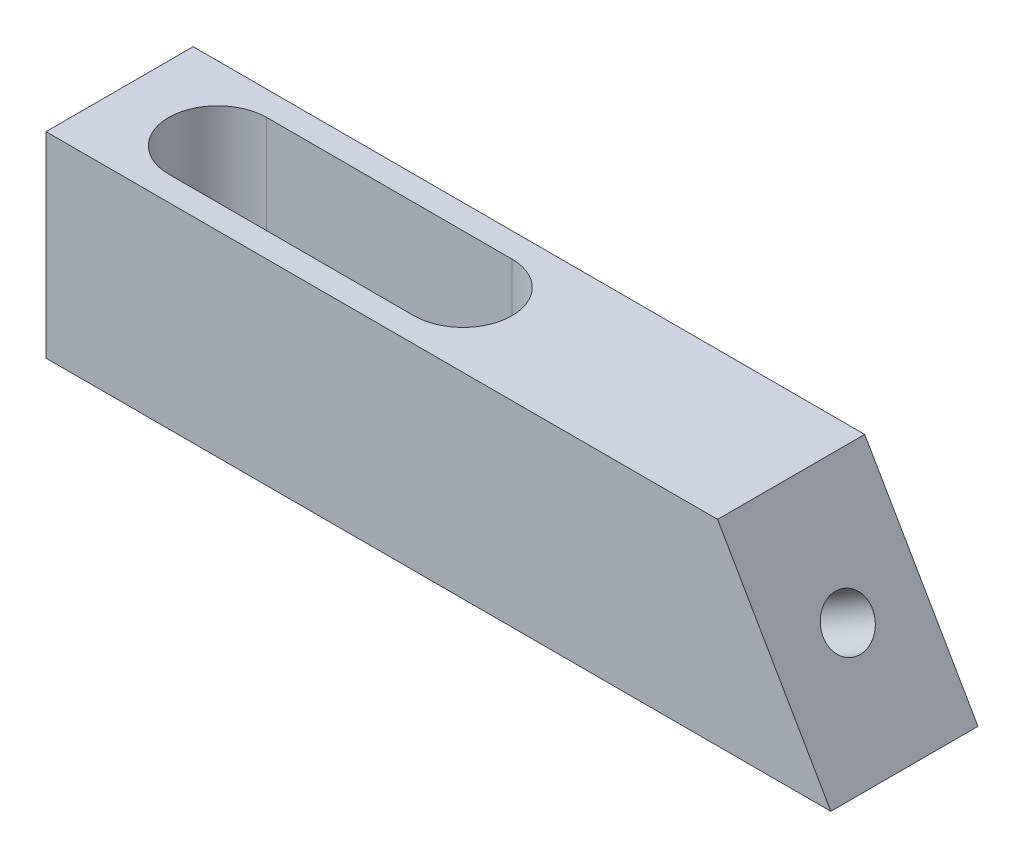
ISO-10303-21;
HEADER;
FILE_DESCRIPTION(('STEP AP214'),'2;1');
FILE_NAME('part.step','',(''),(''),'','','');
FILE_SCHEMA(('AUTOMOTIVE_DESIGN { 1 0 10303 214 1 1 1 1 }'));
ENDSEC;
DATA;
#1=APPLICATION_CONTEXT('core data for automotive mechanical design processes');
#2=APPLICATION_PROTOCOL_DEFINITION('international standard','automotive_design',2000,#1);
#3=PRODUCT_CONTEXT('',#1,'mechanical');
#4=PRODUCT('Part','Part','',(#3));
#5=PRODUCT_RELATED_PRODUCT_CATEGORY('part','',(#4));
#6=PRODUCT_DEFINITION_FORMATION('','',#4);
#7=PRODUCT_DEFINITION_CONTEXT('part definition',#1,'design');
#8=PRODUCT_DEFINITION('design','',#6,#7);
#9=PRODUCT_DEFINITION_SHAPE('','',#8);
#10=(LENGTH_UNIT() NAMED_UNIT(*) SI_UNIT(.MILLI.,.METRE.));
#11=(NAMED_UNIT(*) PLANE_ANGLE_UNIT() SI_UNIT($,.RADIAN.));
#12=(NAMED_UNIT(*) SI_UNIT($,.STERADIAN.) SOLID_ANGLE_UNIT());
#13=UNCERTAINTY_MEASURE_WITH_UNIT(LENGTH_MEASURE(1.E-05),#10,'distance_accuracy_value','');
#14=(GEOMETRIC_REPRESENTATION_CONTEXT(3) GLOBAL_UNCERTAINTY_ASSIGNED_CONTEXT((#13)) GLOBAL_UNIT_ASSIGNED_CONTEXT((#10,
#11,#12)) REPRESENTATION_CONTEXT('',''));
#15=CARTESIAN_POINT('',(0.,0.,0.));
#16=DIRECTION('',(0.,0.,1.));
#17=DIRECTION('',(1.,0.,0.));
#18=AXIS2_PLACEMENT_3D('',#15,#16,#17);
#19=CARTESIAN_POINT('',(101.6,0.,19.05));
#20=DIRECTION('',(0.,1.,0.));
#21=DIRECTION('',(-1.,0.,0.));
#22=AXIS2_PLACEMENT_3D('',#19,#20,#21);
#23=PLANE('',#22);
#24=CARTESIAN_POINT('',(12.7,0.,9.525));
#25=DIRECTION('',(0.,1.,0.));
#26=DIRECTION('',(0.,0.,1.));
#27=AXIS2_PLACEMENT_3D('',#24,#25,#26);
#28=CIRCLE('',#27,3.1877);
#29=CARTESIAN_POINT('',(12.7,0.,12.7127));
#30=VERTEX_POINT('',#29);
#31=EDGE_CURVE('E215',#30,#30,#28,.T.);
#32=ORIENTED_EDGE('',*,*,#31,.T.);
#33=EDGE_LOOP('',(#32));
#34=FACE_BOUND('',#33,.T.);
#35=CARTESIAN_POINT('',(44.45,0.,9.525));
#36=DIRECTION('',(0.,1.,0.));
#37=DIRECTION('',(0.,0.,1.));
#38=AXIS2_PLACEMENT_3D('',#35,#36,#37);
#39=CIRCLE('',#38,3.1877);
#40=CARTESIAN_POINT('',(44.45,0.,12.7127));
#41=VERTEX_POINT('',#40);
#42=EDGE_CURVE('E145',#41,#41,#39,.T.);
#43=ORIENTED_EDGE('',*,*,#42,.T.);
#44=EDGE_LOOP('',(#43));
#45=FACE_BOUND('',#44,.T.);
#46=DIRECTION('',(0.,0.,1.));
#47=VECTOR('',#46,1.);
#48=CARTESIAN_POINT('',(49.2912126503343,0.,19.05));
#49=LINE('',#48,#47);
#50=CARTESIAN_POINT('',(49.2912126503344,0.,3.175));
#51=VERTEX_POINT('',#50);
#52=CARTESIAN_POINT('',(49.2912126503343,0.,15.875));
#53=VERTEX_POINT('',#52);
#54=EDGE_CURVE('E43',#51,#53,#49,.T.);
#55=ORIENTED_EDGE('',*,*,#54,.T.);
#56=DIRECTION('',(1.,0.,0.));
#57=VECTOR('',#56,1.);
#58=CARTESIAN_POINT('',(101.6,0.,15.875));
#59=LINE('',#58,#57);
#60=CARTESIAN_POINT('',(90.6014773719376,0.,15.875));
#61=VERTEX_POINT('',#60);
#62=EDGE_CURVE('E11',#53,#61,#59,.T.);
#63=ORIENTED_EDGE('',*,*,#62,.T.);
#64=DIRECTION('',(0.,0.,1.));
#65=VECTOR('',#64,1.);
#66=CARTESIAN_POINT('',(90.6014773719376,0.,19.05));
#67=LINE('',#66,#65);
#68=CARTESIAN_POINT('',(90.6014773719376,0.,3.175));
#69=VERTEX_POINT('',#68);
#70=EDGE_CURVE('E205',#69,#61,#67,.T.);
#71=ORIENTED_EDGE('',*,*,#70,.F.);
#72=DIRECTION('',(-1.,0.,0.));
#73=VECTOR('',#72,1.);
#74=CARTESIAN_POINT('',(101.6,0.,3.175));
#75=LINE('',#74,#73);
#76=EDGE_CURVE('E207',#69,#51,#75,.T.);
#77=ORIENTED_EDGE('',*,*,#76,.T.);
#78=EDGE_LOOP('',(#55,#63,#71,#77));
#79=FACE_BOUND('',#78,.T.);
#80=DIRECTION('',(1.,0.,0.));
#81=VECTOR('',#80,1.);
#82=CARTESIAN_POINT('',(101.6,0.,0.));
#83=LINE('',#82,#81);
#84=CARTESIAN_POINT('',(0.,0.,0.));
#85=VERTEX_POINT('',#84);
#86=CARTESIAN_POINT('',(101.6,0.,0.));
#87=VERTEX_POINT('',#86);
#88=EDGE_CURVE('E174',#85,#87,#83,.T.);
#89=ORIENTED_EDGE('',*,*,#88,.T.);
#90=DIRECTION('',(0.,0.,-1.));
#91=VECTOR('',#90,1.);
#92=CARTESIAN_POINT('',(101.6,0.,19.05));
#93=LINE('',#92,#91);
#94=CARTESIAN_POINT('',(101.6,0.,19.05));
#95=VERTEX_POINT('',#94);
#96=EDGE_CURVE('E202',#95,#87,#93,.T.);
#97=ORIENTED_EDGE('',*,*,#96,.F.);
#98=DIRECTION('',(1.,0.,0.));
#99=VECTOR('',#98,1.);
#100=CARTESIAN_POINT('',(101.6,0.,19.05));
#101=LINE('',#100,#99);
#102=CARTESIAN_POINT('',(0.,0.,19.05));
#103=VERTEX_POINT('',#102);
#104=EDGE_CURVE('E176',#103,#95,#101,.T.);
#105=ORIENTED_EDGE('',*,*,#104,.F.);
#106=DIRECTION('',(0.,0.,-1.));
#107=VECTOR('',#106,1.);
#108=CARTESIAN_POINT('',(0.,0.,19.05));
#109=LINE('',#108,#107);
#110=EDGE_CURVE('E186',#103,#85,#109,.T.);
#111=ORIENTED_EDGE('',*,*,#110,.T.);
#112=EDGE_LOOP('',(#89,#97,#105,#111));
#113=FACE_BOUND('',#112,.T.);
#114=ADVANCED_FACE('F35',(#34,#45,#79,#113),#23,.F.);
#115=CARTESIAN_POINT('',(86.9353031625833,25.4,19.05));
#116=DIRECTION('',(-0.866025403784436,-0.500000000000005,0.));
#117=DIRECTION('',(0.500000000000005,-0.866025403784436,0.));
#118=AXIS2_PLACEMENT_3D('',#115,#116,#117);
#119=PLANE('',#118);
#120=CARTESIAN_POINT('',(94.2676515812917,12.7,9.525));
#121=DIRECTION('',(0.866025403784436,0.500000000000005,0.));
#122=DIRECTION('',(-0.500000000000005,0.866025403784436,0.));
#123=AXIS2_PLACEMENT_3D('',#120,#121,#122);
#124=CIRCLE('',#123,3.1877);
#125=CARTESIAN_POINT('',(92.6738015812917,15.4606291796437,9.525));
#126=VERTEX_POINT('',#125);
#127=EDGE_CURVE('E157',#126,#126,#124,.T.);
#128=ORIENTED_EDGE('',*,*,#127,.F.);
#129=EDGE_LOOP('',(#128));
#130=FACE_BOUND('',#129,.T.);
#131=DIRECTION('',(-0.500000000000004,0.866025403784436,0.));
#132=VECTOR('',#131,1.);
#133=CARTESIAN_POINT('',(86.9353031625833,25.4,0.));
#134=LINE('',#133,#132);
#135=CARTESIAN_POINT('',(86.9353031625833,25.4,0.));
#136=VERTEX_POINT('',#135);
#137=EDGE_CURVE('E189',#87,#136,#134,.T.);
#138=ORIENTED_EDGE('',*,*,#137,.T.);
#139=DIRECTION('',(0.,0.,-1.));
#140=VECTOR('',#139,1.);
#141=CARTESIAN_POINT('',(86.9353031625833,25.4,19.05));
#142=LINE('',#141,#140);
#143=CARTESIAN_POINT('',(86.9353031625833,25.4,19.05));
#144=VERTEX_POINT('',#143);
#145=EDGE_CURVE('E199',#144,#136,#142,.T.);
#146=ORIENTED_EDGE('',*,*,#145,.F.);
#147=DIRECTION('',(-0.500000000000004,0.866025403784436,0.));
#148=VECTOR('',#147,1.);
#149=CARTESIAN_POINT('',(86.9353031625833,25.4,19.05));
#150=LINE('',#149,#148);
#151=EDGE_CURVE('E179',#95,#144,#150,.T.);
#152=ORIENTED_EDGE('',*,*,#151,.F.);
#153=ORIENTED_EDGE('',*,*,#96,.T.);
#154=EDGE_LOOP('',(#138,#146,#152,#153));
#155=FACE_BOUND('',#154,.T.);
#156=ADVANCED_FACE('F240',(#130,#155),#119,.F.);
#157=CARTESIAN_POINT('',(0.,25.4,19.05));
#158=DIRECTION('',(0.,-1.,0.));
#159=DIRECTION('',(0.,0.,-1.));
#160=AXIS2_PLACEMENT_3D('',#157,#158,#159);
#161=PLANE('',#160);
#162=DIRECTION('',(1.,0.,0.));
#163=VECTOR('',#162,1.);
#164=CARTESIAN_POINT('',(12.7,25.4,15.875));
#165=LINE('',#164,#163);
#166=CARTESIAN_POINT('',(12.7,25.4,15.875));
#167=VERTEX_POINT('',#166);
#168=CARTESIAN_POINT('',(44.45,25.4,15.875));
#169=VERTEX_POINT('',#168);
#170=EDGE_CURVE('E151',#167,#169,#165,.T.);
#171=ORIENTED_EDGE('',*,*,#170,.F.);
#172=CARTESIAN_POINT('',(12.7,25.4,9.525));
#173=DIRECTION('',(0.,1.,0.));
#174=DIRECTION('',(0.,0.,1.));
#175=AXIS2_PLACEMENT_3D('',#172,#173,#174);
#176=CIRCLE('',#175,6.35);
#177=CARTESIAN_POINT('',(12.7,25.4,3.175));
#178=VERTEX_POINT('',#177);
#179=EDGE_CURVE('E51',#178,#167,#176,.T.);
#180=ORIENTED_EDGE('',*,*,#179,.F.);
#181=DIRECTION('',(1.,0.,0.));
#182=VECTOR('',#181,1.);
#183=CARTESIAN_POINT('',(12.7,25.4,3.175));
#184=LINE('',#183,#182);
#185=CARTESIAN_POINT('',(44.45,25.4,3.175));
#186=VERTEX_POINT('',#185);
#187=EDGE_CURVE('E139',#178,#186,#184,.T.);
#188=ORIENTED_EDGE('',*,*,#187,.T.);
#189=CARTESIAN_POINT('',(44.45,25.4,9.525));
#190=DIRECTION('',(0.,1.,0.));
#191=DIRECTION('',(0.,0.,1.));
#192=AXIS2_PLACEMENT_3D('',#189,#190,#191);
#193=CIRCLE('',#192,6.35000000000001);
#194=EDGE_CURVE('E142',#169,#186,#193,.T.);
#195=ORIENTED_EDGE('',*,*,#194,.F.);
#196=EDGE_LOOP('',(#171,#180,#188,#195));
#197=FACE_BOUND('',#196,.T.);
#198=DIRECTION('',(-1.,0.,0.));
#199=VECTOR('',#198,1.);
#200=CARTESIAN_POINT('',(0.,25.4,0.));
#201=LINE('',#200,#199);
#202=CARTESIAN_POINT('',(0.,25.4,0.));
#203=VERTEX_POINT('',#202);
#204=EDGE_CURVE('E191',#136,#203,#201,.T.);
#205=ORIENTED_EDGE('',*,*,#204,.T.);
#206=DIRECTION('',(0.,0.,-1.));
#207=VECTOR('',#206,1.);
#208=CARTESIAN_POINT('',(0.,25.4,19.05));
#209=LINE('',#208,#207);
#210=CARTESIAN_POINT('',(0.,25.4,19.05));
#211=VERTEX_POINT('',#210);
#212=EDGE_CURVE('E196',#211,#203,#209,.T.);
#213=ORIENTED_EDGE('',*,*,#212,.F.);
#214=DIRECTION('',(-1.,0.,0.));
#215=VECTOR('',#214,1.);
#216=CARTESIAN_POINT('',(0.,25.4,19.05));
#217=LINE('',#216,#215);
#218=EDGE_CURVE('E182',#144,#211,#217,.T.);
#219=ORIENTED_EDGE('',*,*,#218,.F.);
#220=ORIENTED_EDGE('',*,*,#145,.T.);
#221=EDGE_LOOP('',(#205,#213,#219,#220));
#222=FACE_BOUND('',#221,.T.);
#223=ADVANCED_FACE('F244',(#197,#222),#161,.F.);
#224=CARTESIAN_POINT('',(0.,0.,19.05));
#225=DIRECTION('',(1.,0.,0.));
#226=DIRECTION('',(0.,0.,-1.));
#227=AXIS2_PLACEMENT_3D('',#224,#225,#226);
#228=PLANE('',#227);
#229=DIRECTION('',(0.,-1.,0.));
#230=VECTOR('',#229,1.);
#231=CARTESIAN_POINT('',(0.,0.,0.));
#232=LINE('',#231,#230);
#233=EDGE_CURVE('E180',#203,#85,#232,.T.);
#234=ORIENTED_EDGE('',*,*,#233,.T.);
#235=ORIENTED_EDGE('',*,*,#110,.F.);
#236=DIRECTION('',(0.,-1.,0.));
#237=VECTOR('',#236,1.);
#238=CARTESIAN_POINT('',(0.,0.,19.05));
#239=LINE('',#238,#237);
#240=EDGE_CURVE('E184',#211,#103,#239,.T.);
#241=ORIENTED_EDGE('',*,*,#240,.F.);
#242=ORIENTED_EDGE('',*,*,#212,.T.);
#243=EDGE_LOOP('',(#234,#235,#241,#242));
#244=FACE_BOUND('',#243,.T.);
#245=ADVANCED_FACE('F249',(#244),#228,.F.);
#246=CARTESIAN_POINT('',(0.,0.,19.05));
#247=DIRECTION('',(0.,0.,-1.));
#248=DIRECTION('',(-1.,0.,0.));
#249=AXIS2_PLACEMENT_3D('',#246,#247,#248);
#250=PLANE('',#249);
#251=ORIENTED_EDGE('',*,*,#104,.T.);
#252=ORIENTED_EDGE('',*,*,#151,.T.);
#253=ORIENTED_EDGE('',*,*,#218,.T.);
#254=ORIENTED_EDGE('',*,*,#240,.T.);
#255=EDGE_LOOP('',(#251,#252,#253,#254));
#256=FACE_BOUND('',#255,.T.);
#257=ADVANCED_FACE('F257',(#256),#250,.F.);
#258=CARTESIAN_POINT('',(0.,0.,0.));
#259=DIRECTION('',(0.,0.,-1.));
#260=DIRECTION('',(-1.,0.,0.));
#261=AXIS2_PLACEMENT_3D('',#258,#259,#260);
#262=PLANE('',#261);
#263=ORIENTED_EDGE('',*,*,#88,.F.);
#264=ORIENTED_EDGE('',*,*,#233,.F.);
#265=ORIENTED_EDGE('',*,*,#204,.F.);
#266=ORIENTED_EDGE('',*,*,#137,.F.);
#267=EDGE_LOOP('',(#263,#264,#265,#266));
#268=FACE_BOUND('',#267,.T.);
#269=ADVANCED_FACE('F259',(#268),#262,.T.);
#270=CARTESIAN_POINT('',(37.0381068406679,-64.1518828642003,15.875));
#271=DIRECTION('',(0.,0.,1.));
#272=DIRECTION('',(0.,-1.,0.));
#273=AXIS2_PLACEMENT_3D('',#270,#271,#272);
#274=PLANE('',#273);
#275=DIRECTION('',(0.866025403784436,0.500000000000005,0.));
#276=VECTOR('',#275,1.);
#277=CARTESIAN_POINT('',(12.3228031625838,-21.3437211692653,15.875));
#278=LINE('',#277,#276);
#279=CARTESIAN_POINT('',(80.2739111915366,17.8878693429844,15.875));
#280=VERTEX_POINT('',#279);
#281=EDGE_CURVE('E172',#53,#280,#278,.T.);
#282=ORIENTED_EDGE('',*,*,#281,.T.);
#283=DIRECTION('',(0.500000000000005,-0.866025403784436,0.));
#284=VECTOR('',#283,1.);
#285=CARTESIAN_POINT('',(104.989214869621,-24.9202923519506,15.875));
#286=LINE('',#285,#284);
#287=EDGE_CURVE('E164',#280,#61,#286,.T.);
#288=ORIENTED_EDGE('',*,*,#287,.T.);
#289=ORIENTED_EDGE('',*,*,#62,.F.);
#290=EDGE_LOOP('',(#282,#288,#289));
#291=FACE_BOUND('',#290,.T.);
#292=ADVANCED_FACE('F262',(#291),#274,.F.);
#293=CARTESIAN_POINT('',(12.3228031625838,-21.3437211692653,15.875));
#294=DIRECTION('',(-0.500000000000005,0.866025403784436,0.));
#295=DIRECTION('',(-0.866025403784436,-0.500000000000005,0.));
#296=AXIS2_PLACEMENT_3D('',#293,#294,#295);
#297=PLANE('',#296);
#298=DIRECTION('',(0.866025403784436,0.500000000000005,0.));
#299=VECTOR('',#298,1.);
#300=CARTESIAN_POINT('',(12.3228031625838,-21.3437211692653,3.175));
#301=LINE('',#300,#299);
#302=CARTESIAN_POINT('',(80.2739111915366,17.8878693429844,3.175));
#303=VERTEX_POINT('',#302);
#304=EDGE_CURVE('E171',#51,#303,#301,.T.);
#305=ORIENTED_EDGE('',*,*,#304,.T.);
#306=DIRECTION('',(0.,0.,1.));
#307=VECTOR('',#306,1.);
#308=CARTESIAN_POINT('',(80.2739111915366,17.8878693429844,15.875));
#309=LINE('',#308,#307);
#310=EDGE_CURVE('E168',#303,#280,#309,.T.);
#311=ORIENTED_EDGE('',*,*,#310,.T.);
#312=ORIENTED_EDGE('',*,*,#281,.F.);
#313=ORIENTED_EDGE('',*,*,#54,.F.);
#314=EDGE_LOOP('',(#305,#311,#312,#313));
#315=FACE_BOUND('',#314,.T.);
#316=ADVANCED_FACE('F269',(#315),#297,.F.);
#317=CARTESIAN_POINT('',(12.3228031625838,-21.3437211692653,3.175));
#318=DIRECTION('',(0.,0.,-1.));
#319=DIRECTION('',(0.,1.,0.));
#320=AXIS2_PLACEMENT_3D('',#317,#318,#319);
#321=PLANE('',#320);
#322=DIRECTION('',(-0.500000000000005,0.866025403784436,0.));
#323=VECTOR('',#322,1.);
#324=CARTESIAN_POINT('',(80.2739111915366,17.8878693429844,3.175));
#325=LINE('',#324,#323);
#326=EDGE_CURVE('E59',#69,#303,#325,.T.);
#327=ORIENTED_EDGE('',*,*,#326,.T.);
#328=ORIENTED_EDGE('',*,*,#304,.F.);
#329=ORIENTED_EDGE('',*,*,#76,.F.);
#330=EDGE_LOOP('',(#327,#328,#329));
#331=FACE_BOUND('',#330,.T.);
#332=ADVANCED_FACE('F271',(#331),#321,.F.);
#333=CARTESIAN_POINT('',(67.9511080289528,39.2315905122497,0.));
#334=DIRECTION('',(-0.866025403784436,-0.500000000000005,0.));
#335=DIRECTION('',(0.500000000000005,-0.866025403784436,0.));
#336=AXIS2_PLACEMENT_3D('',#333,#334,#335);
#337=PLANE('',#336);
#338=CARTESIAN_POINT('',(86.018759610245,7.93749999999998,9.525));
#339=DIRECTION('',(-0.866025403784436,-0.500000000000005,0.));
#340=DIRECTION('',(0.500000000000005,-0.866025403784436,0.));
#341=AXIS2_PLACEMENT_3D('',#338,#339,#340);
#342=CIRCLE('',#341,3.1877);
#343=CARTESIAN_POINT('',(87.612609610245,5.17687082035633,9.525));
#344=VERTEX_POINT('',#343);
#345=EDGE_CURVE('E163',#344,#344,#342,.T.);
#346=ORIENTED_EDGE('',*,*,#345,.F.);
#347=EDGE_LOOP('',(#346));
#348=FACE_BOUND('',#347,.T.);
#349=ORIENTED_EDGE('',*,*,#70,.T.);
#350=ORIENTED_EDGE('',*,*,#287,.F.);
#351=ORIENTED_EDGE('',*,*,#310,.F.);
#352=ORIENTED_EDGE('',*,*,#326,.F.);
#353=EDGE_LOOP('',(#349,#350,#351,#352));
#354=FACE_BOUND('',#353,.T.);
#355=ADVANCED_FACE('F274',(#348,#354),#337,.T.);
#356=CARTESIAN_POINT('',(18.0676515812921,-31.2940905122498,9.525));
#357=DIRECTION('',(0.866025403784436,0.500000000000005,0.));
#358=DIRECTION('',(-0.500000000000005,0.866025403784436,0.));
#359=AXIS2_PLACEMENT_3D('',#356,#357,#358);
#360=CYLINDRICAL_SURFACE('',#359,3.1877);
#361=ORIENTED_EDGE('',*,*,#345,.T.);
#362=EDGE_LOOP('',(#361));
#363=FACE_BOUND('',#362,.T.);
#364=ORIENTED_EDGE('',*,*,#127,.T.);
#365=EDGE_LOOP('',(#364));
#366=FACE_BOUND('',#365,.T.);
#367=ADVANCED_FACE('F281',(#363,#366),#360,.F.);
#368=CARTESIAN_POINT('',(12.7,12.7,9.525));
#369=DIRECTION('',(0.,1.,0.));
#370=DIRECTION('',(0.,0.,1.));
#371=AXIS2_PLACEMENT_3D('',#368,#369,#370);
#372=CYLINDRICAL_SURFACE('',#371,6.35);
#373=ORIENTED_EDGE('',*,*,#179,.T.);
#374=DIRECTION('',(0.,1.,0.));
#375=VECTOR('',#374,1.);
#376=CARTESIAN_POINT('',(12.7,12.7,15.875));
#377=LINE('',#376,#375);
#378=CARTESIAN_POINT('',(12.7,12.7,15.875));
#379=VERTEX_POINT('',#378);
#380=EDGE_CURVE('E118',#379,#167,#377,.T.);
#381=ORIENTED_EDGE('',*,*,#380,.F.);
#382=CARTESIAN_POINT('',(12.7,12.7,9.525));
#383=DIRECTION('',(0.,1.,0.));
#384=DIRECTION('',(0.,0.,1.));
#385=AXIS2_PLACEMENT_3D('',#382,#383,#384);
#386=CIRCLE('',#385,6.35);
#387=CARTESIAN_POINT('',(12.7,12.7,3.175));
#388=VERTEX_POINT('',#387);
#389=EDGE_CURVE('E122',#388,#379,#386,.T.);
#390=ORIENTED_EDGE('',*,*,#389,.F.);
#391=DIRECTION('',(0.,1.,0.));
#392=VECTOR('',#391,1.);
#393=CARTESIAN_POINT('',(12.7,12.7,3.175));
#394=LINE('',#393,#392);
#395=EDGE_CURVE('E155',#388,#178,#394,.T.);
#396=ORIENTED_EDGE('',*,*,#395,.T.);
#397=EDGE_LOOP('',(#373,#381,#390,#396));
#398=FACE_BOUND('',#397,.T.);
#399=ADVANCED_FACE('F120',(#398),#372,.F.);
#400=CARTESIAN_POINT('',(12.7,12.7,3.175));
#401=DIRECTION('',(0.,0.,1.));
#402=DIRECTION('',(1.,0.,0.));
#403=AXIS2_PLACEMENT_3D('',#400,#401,#402);
#404=PLANE('',#403);
#405=ORIENTED_EDGE('',*,*,#187,.F.);
#406=ORIENTED_EDGE('',*,*,#395,.F.);
#407=DIRECTION('',(1.,0.,0.));
#408=VECTOR('',#407,1.);
#409=CARTESIAN_POINT('',(12.7,12.7,3.175));
#410=LINE('',#409,#408);
#411=CARTESIAN_POINT('',(44.45,12.7,3.175));
#412=VERTEX_POINT('',#411);
#413=EDGE_CURVE('E127',#388,#412,#410,.T.);
#414=ORIENTED_EDGE('',*,*,#413,.T.);
#415=DIRECTION('',(0.,1.,0.));
#416=VECTOR('',#415,1.);
#417=CARTESIAN_POINT('',(44.45,12.7,3.175));
#418=LINE('',#417,#416);
#419=EDGE_CURVE('E158',#412,#186,#418,.T.);
#420=ORIENTED_EDGE('',*,*,#419,.T.);
#421=EDGE_LOOP('',(#405,#406,#414,#420));
#422=FACE_BOUND('',#421,.T.);
#423=ADVANCED_FACE('F288',(#422),#404,.T.);
#424=CARTESIAN_POINT('',(44.45,12.7,9.525));
#425=DIRECTION('',(0.,1.,0.));
#426=DIRECTION('',(0.,0.,1.));
#427=AXIS2_PLACEMENT_3D('',#424,#425,#426);
#428=CYLINDRICAL_SURFACE('',#427,6.35000000000001);
#429=ORIENTED_EDGE('',*,*,#194,.T.);
#430=ORIENTED_EDGE('',*,*,#419,.F.);
#431=CARTESIAN_POINT('',(44.45,12.7,9.525));
#432=DIRECTION('',(0.,1.,0.));
#433=DIRECTION('',(0.,0.,1.));
#434=AXIS2_PLACEMENT_3D('',#431,#432,#433);
#435=CIRCLE('',#434,6.35000000000001);
#436=CARTESIAN_POINT('',(44.45,12.7,15.875));
#437=VERTEX_POINT('',#436);
#438=EDGE_CURVE('E135',#437,#412,#435,.T.);
#439=ORIENTED_EDGE('',*,*,#438,.F.);
#440=DIRECTION('',(0.,1.,0.));
#441=VECTOR('',#440,1.);
#442=CARTESIAN_POINT('',(44.45,12.7,15.875));
#443=LINE('',#442,#441);
#444=EDGE_CURVE('E126',#437,#169,#443,.T.);
#445=ORIENTED_EDGE('',*,*,#444,.T.);
#446=EDGE_LOOP('',(#429,#430,#439,#445));
#447=FACE_BOUND('',#446,.T.);
#448=ADVANCED_FACE('F291',(#447),#428,.F.);
#449=CARTESIAN_POINT('',(12.7,12.7,15.875));
#450=DIRECTION('',(0.,0.,1.));
#451=DIRECTION('',(1.,0.,0.));
#452=AXIS2_PLACEMENT_3D('',#449,#450,#451);
#453=PLANE('',#452);
#454=ORIENTED_EDGE('',*,*,#170,.T.);
#455=ORIENTED_EDGE('',*,*,#444,.F.);
#456=DIRECTION('',(1.,0.,0.));
#457=VECTOR('',#456,1.);
#458=CARTESIAN_POINT('',(12.7,12.7,15.875));
#459=LINE('',#458,#457);
#460=EDGE_CURVE('E130',#379,#437,#459,.T.);
#461=ORIENTED_EDGE('',*,*,#460,.F.);
#462=ORIENTED_EDGE('',*,*,#380,.T.);
#463=EDGE_LOOP('',(#454,#455,#461,#462));
#464=FACE_BOUND('',#463,.T.);
#465=ADVANCED_FACE('F131',(#464),#453,.F.);
#466=CARTESIAN_POINT('',(12.7,12.7,9.525));
#467=DIRECTION('',(0.,1.,0.));
#468=DIRECTION('',(0.,0.,1.));
#469=AXIS2_PLACEMENT_3D('',#466,#467,#468);
#470=PLANE('',#469);
#471=CARTESIAN_POINT('',(12.7,12.7,9.525));
#472=DIRECTION('',(0.,1.,0.));
#473=DIRECTION('',(0.,0.,1.));
#474=AXIS2_PLACEMENT_3D('',#471,#472,#473);
#475=CIRCLE('',#474,3.1877);
#476=CARTESIAN_POINT('',(12.7,12.7,12.7127));
#477=VERTEX_POINT('',#476);
#478=EDGE_CURVE('E38',#477,#477,#475,.T.);
#479=ORIENTED_EDGE('',*,*,#478,.F.);
#480=EDGE_LOOP('',(#479));
#481=FACE_BOUND('',#480,.T.);
#482=CARTESIAN_POINT('',(44.45,12.7,9.525));
#483=DIRECTION('',(0.,1.,0.));
#484=DIRECTION('',(0.,0.,1.));
#485=AXIS2_PLACEMENT_3D('',#482,#483,#484);
#486=CIRCLE('',#485,3.1877);
#487=CARTESIAN_POINT('',(44.45,12.7,12.7127));
#488=VERTEX_POINT('',#487);
#489=EDGE_CURVE('E213',#488,#488,#486,.T.);
#490=ORIENTED_EDGE('',*,*,#489,.F.);
#491=EDGE_LOOP('',(#490));
#492=FACE_BOUND('',#491,.T.);
#493=ORIENTED_EDGE('',*,*,#389,.T.);
#494=ORIENTED_EDGE('',*,*,#460,.T.);
#495=ORIENTED_EDGE('',*,*,#438,.T.);
#496=ORIENTED_EDGE('',*,*,#413,.F.);
#497=EDGE_LOOP('',(#493,#494,#495,#496));
#498=FACE_BOUND('',#497,.T.);
#499=ADVANCED_FACE('F138',(#481,#492,#498),#470,.T.);
#500=CARTESIAN_POINT('',(44.45,0.,9.525));
#501=DIRECTION('',(0.,1.,0.));
#502=DIRECTION('',(0.,0.,1.));
#503=AXIS2_PLACEMENT_3D('',#500,#501,#502);
#504=CYLINDRICAL_SURFACE('',#503,3.1877);
#505=CARTESIAN_POINT('',(44.45,12.7,12.7127));
#506=CARTESIAN_POINT('',(44.45,12.5677083333333,12.7127));
#507=CARTESIAN_POINT('',(44.45,12.4354166666667,12.7127));
#508=CARTESIAN_POINT('',(44.45,12.1708333333333,12.7127));
#509=CARTESIAN_POINT('',(44.45,12.0385416666667,12.7127));
#510=CARTESIAN_POINT('',(44.45,11.7739583333333,12.7127));
#511=CARTESIAN_POINT('',(44.45,11.6416666666667,12.7127));
#512=CARTESIAN_POINT('',(44.45,11.3770833333333,12.7127));
#513=CARTESIAN_POINT('',(44.45,11.2447916666667,12.7127));
#514=CARTESIAN_POINT('',(44.45,10.9802083333333,12.7127));
#515=CARTESIAN_POINT('',(44.45,10.8479166666667,12.7127));
#516=CARTESIAN_POINT('',(44.45,10.5833333333333,12.7127));
#517=CARTESIAN_POINT('',(44.45,10.4510416666667,12.7127));
#518=CARTESIAN_POINT('',(44.45,10.1864583333333,12.7127));
#519=CARTESIAN_POINT('',(44.45,10.0541666666667,12.7127));
#520=CARTESIAN_POINT('',(44.45,9.78958333333333,12.7127));
#521=CARTESIAN_POINT('',(44.45,9.65729166666666,12.7127));
#522=CARTESIAN_POINT('',(44.45,9.39270833333333,12.7127));
#523=CARTESIAN_POINT('',(44.45,9.26041666666666,12.7127));
#524=CARTESIAN_POINT('',(44.45,8.99583333333333,12.7127));
#525=CARTESIAN_POINT('',(44.45,8.86354166666666,12.7127));
#526=CARTESIAN_POINT('',(44.45,8.59895833333333,12.7127));
#527=CARTESIAN_POINT('',(44.45,8.46666666666666,12.7127));
#528=CARTESIAN_POINT('',(44.45,8.20208333333333,12.7127));
#529=CARTESIAN_POINT('',(44.45,8.06979166666666,12.7127));
#530=CARTESIAN_POINT('',(44.45,7.80520833333333,12.7127));
#531=CARTESIAN_POINT('',(44.45,7.67291666666666,12.7127));
#532=CARTESIAN_POINT('',(44.45,7.40833333333333,12.7127));
#533=CARTESIAN_POINT('',(44.45,7.27604166666666,12.7127));
#534=CARTESIAN_POINT('',(44.45,7.01145833333333,12.7127));
#535=CARTESIAN_POINT('',(44.45,6.87916666666666,12.7127));
#536=CARTESIAN_POINT('',(44.45,6.61458333333333,12.7127));
#537=CARTESIAN_POINT('',(44.45,6.48229166666666,12.7127));
#538=CARTESIAN_POINT('',(44.45,6.21770833333333,12.7127));
#539=CARTESIAN_POINT('',(44.45,6.08541666666666,12.7127));
#540=CARTESIAN_POINT('',(44.45,5.82083333333333,12.7127));
#541=CARTESIAN_POINT('',(44.45,5.68854166666666,12.7127));
#542=CARTESIAN_POINT('',(44.45,5.42395833333333,12.7127));
#543=CARTESIAN_POINT('',(44.45,5.29166666666666,12.7127));
#544=CARTESIAN_POINT('',(44.45,5.02708333333333,12.7127));
#545=CARTESIAN_POINT('',(44.45,4.89479166666666,12.7127));
#546=CARTESIAN_POINT('',(44.45,4.63020833333333,12.7127));
#547=CARTESIAN_POINT('',(44.45,4.49791666666666,12.7127));
#548=CARTESIAN_POINT('',(44.45,4.23333333333333,12.7127));
#549=CARTESIAN_POINT('',(44.45,4.10104166666666,12.7127));
#550=CARTESIAN_POINT('',(44.45,3.83645833333333,12.7127));
#551=CARTESIAN_POINT('',(44.45,3.70416666666666,12.7127));
#552=CARTESIAN_POINT('',(44.45,3.43958333333333,12.7127));
#553=CARTESIAN_POINT('',(44.45,3.30729166666666,12.7127));
#554=CARTESIAN_POINT('',(44.45,3.04270833333333,12.7127));
#555=CARTESIAN_POINT('',(44.45,2.91041666666666,12.7127));
#556=CARTESIAN_POINT('',(44.45,2.64583333333333,12.7127));
#557=CARTESIAN_POINT('',(44.45,2.51354166666666,12.7127));
#558=CARTESIAN_POINT('',(44.45,2.24895833333333,12.7127));
#559=CARTESIAN_POINT('',(44.45,2.11666666666666,12.7127));
#560=CARTESIAN_POINT('',(44.45,1.85208333333333,12.7127));
#561=CARTESIAN_POINT('',(44.45,1.71979166666666,12.7127));
#562=CARTESIAN_POINT('',(44.45,1.45520833333333,12.7127));
#563=CARTESIAN_POINT('',(44.45,1.32291666666666,12.7127));
#564=CARTESIAN_POINT('',(44.45,1.05833333333333,12.7127));
#565=CARTESIAN_POINT('',(44.45,0.926041666666663,12.7127));
#566=CARTESIAN_POINT('',(44.45,0.661458333333329,12.7127));
#567=CARTESIAN_POINT('',(44.45,0.529166666666663,12.7127));
#568=CARTESIAN_POINT('',(44.45,0.26458333333333,12.7127));
#569=CARTESIAN_POINT('',(44.45,0.132291666666663,12.7127));
#570=CARTESIAN_POINT('',(44.45,0.,12.7127));
#571=B_SPLINE_CURVE_WITH_KNOTS('',3,(#505,#506,#507,#508,#509,#510,#511,#512,#513,#514,#515,
#516,#517,#518,#519,#520,#521,#522,#523,#524,#525,#526,#527,#528,#529,#530,#531,#532,#533,#534,
#535,#536,#537,#538,#539,#540,#541,#542,#543,#544,#545,#546,#547,#548,#549,#550,#551,#552,#553,
#554,#555,#556,#557,#558,#559,#560,#561,#562,#563,#564,#565,#566,#567,#568,#569,#570),
.UNSPECIFIED.,.F.,.F.,(4,2,2,2,2,2,2,2,2,2,2,2,2,2,2,2,2,2,2,2,2,2,2,2,2,2,2,2,2,2,2,2,4),(0.,
0.396875,0.793749999999999,1.190625,1.5875,1.984375,2.38125,2.778125,3.175,3.571875,3.96875,
4.365625,4.7625,5.159375,5.55625,5.953125,6.35,6.746875,7.14375,7.540625,7.9375,8.334375,
8.73125,9.128125,9.525,9.921875,10.31875,10.715625,11.1125,11.509375,11.90625,12.303125,12.7),.UNSPECIFIED.);
#572=EDGE_CURVE('BSEAM227',#488,#41,#571,.T.);
#573=ORIENTED_EDGE('',*,*,#489,.T.);
#574=ORIENTED_EDGE('',*,*,#42,.F.);
#575=ORIENTED_EDGE('',*,*,#572,.T.);
#576=ORIENTED_EDGE('',*,*,#572,.F.);
#577=EDGE_LOOP('',(#573,#575,#574,#576));
#578=FACE_BOUND('',#577,.T.);
#579=ADVANCED_FACE('F227',(#578),#504,.F.);
#580=CARTESIAN_POINT('',(12.7,0.,9.525));
#581=DIRECTION('',(0.,1.,0.));
#582=DIRECTION('',(0.,0.,1.));
#583=AXIS2_PLACEMENT_3D('',#580,#581,#582);
#584=CYLINDRICAL_SURFACE('',#583,3.1877);
#585=CARTESIAN_POINT('',(12.7,12.7,12.7127));
#586=CARTESIAN_POINT('',(12.7,12.5677083333333,12.7127));
#587=CARTESIAN_POINT('',(12.7,12.4354166666667,12.7127));
#588=CARTESIAN_POINT('',(12.7,12.1708333333333,12.7127));
#589=CARTESIAN_POINT('',(12.7,12.0385416666667,12.7127));
#590=CARTESIAN_POINT('',(12.7,11.7739583333333,12.7127));
#591=CARTESIAN_POINT('',(12.7,11.6416666666667,12.7127));
#592=CARTESIAN_POINT('',(12.7,11.3770833333333,12.7127));
#593=CARTESIAN_POINT('',(12.7,11.2447916666667,12.7127));
#594=CARTESIAN_POINT('',(12.7,10.9802083333333,12.7127));
#595=CARTESIAN_POINT('',(12.7,10.8479166666667,12.7127));
#596=CARTESIAN_POINT('',(12.7,10.5833333333333,12.7127));
#597=CARTESIAN_POINT('',(12.7,10.4510416666667,12.7127));
#598=CARTESIAN_POINT('',(12.7,10.1864583333333,12.7127));
#599=CARTESIAN_POINT('',(12.7,10.0541666666667,12.7127));
#600=CARTESIAN_POINT('',(12.7,9.78958333333333,12.7127));
#601=CARTESIAN_POINT('',(12.7,9.65729166666666,12.7127));
#602=CARTESIAN_POINT('',(12.7,9.39270833333333,12.7127));
#603=CARTESIAN_POINT('',(12.7,9.26041666666666,12.7127));
#604=CARTESIAN_POINT('',(12.7,8.99583333333333,12.7127));
#605=CARTESIAN_POINT('',(12.7,8.86354166666666,12.7127));
#606=CARTESIAN_POINT('',(12.7,8.59895833333333,12.7127));
#607=CARTESIAN_POINT('',(12.7,8.46666666666666,12.7127));
#608=CARTESIAN_POINT('',(12.7,8.20208333333333,12.7127));
#609=CARTESIAN_POINT('',(12.7,8.06979166666666,12.7127));
#610=CARTESIAN_POINT('',(12.7,7.80520833333333,12.7127));
#611=CARTESIAN_POINT('',(12.7,7.67291666666666,12.7127));
#612=CARTESIAN_POINT('',(12.7,7.40833333333333,12.7127));
#613=CARTESIAN_POINT('',(12.7,7.27604166666666,12.7127));
#614=CARTESIAN_POINT('',(12.7,7.01145833333333,12.7127));
#615=CARTESIAN_POINT('',(12.7,6.87916666666666,12.7127));
#616=CARTESIAN_POINT('',(12.7,6.61458333333333,12.7127));
#617=CARTESIAN_POINT('',(12.7,6.48229166666666,12.7127));
#618=CARTESIAN_POINT('',(12.7,6.21770833333333,12.7127));
#619=CARTESIAN_POINT('',(12.7,6.08541666666666,12.7127));
#620=CARTESIAN_POINT('',(12.7,5.82083333333333,12.7127));
#621=CARTESIAN_POINT('',(12.7,5.68854166666666,12.7127));
#622=CARTESIAN_POINT('',(12.7,5.42395833333333,12.7127));
#623=CARTESIAN_POINT('',(12.7,5.29166666666666,12.7127));
#624=CARTESIAN_POINT('',(12.7,5.02708333333333,12.7127));
#625=CARTESIAN_POINT('',(12.7,4.89479166666666,12.7127));
#626=CARTESIAN_POINT('',(12.7,4.63020833333333,12.7127));
#627=CARTESIAN_POINT('',(12.7,4.49791666666666,12.7127));
#628=CARTESIAN_POINT('',(12.7,4.23333333333333,12.7127));
#629=CARTESIAN_POINT('',(12.7,4.10104166666666,12.7127));
#630=CARTESIAN_POINT('',(12.7,3.83645833333333,12.7127));
#631=CARTESIAN_POINT('',(12.7,3.70416666666666,12.7127));
#632=CARTESIAN_POINT('',(12.7,3.43958333333333,12.7127));
#633=CARTESIAN_POINT('',(12.7,3.30729166666666,12.7127));
#634=CARTESIAN_POINT('',(12.7,3.04270833333333,12.7127));
#635=CARTESIAN_POINT('',(12.7,2.91041666666666,12.7127));
#636=CARTESIAN_POINT('',(12.7,2.64583333333333,12.7127));
#637=CARTESIAN_POINT('',(12.7,2.51354166666666,12.7127));
#638=CARTESIAN_POINT('',(12.7,2.24895833333333,12.7127));
#639=CARTESIAN_POINT('',(12.7,2.11666666666666,12.7127));
#640=CARTESIAN_POINT('',(12.7,1.85208333333333,12.7127));
#641=CARTESIAN_POINT('',(12.7,1.71979166666666,12.7127));
#642=CARTESIAN_POINT('',(12.7,1.45520833333333,12.7127));
#643=CARTESIAN_POINT('',(12.7,1.32291666666666,12.7127));
#644=CARTESIAN_POINT('',(12.7,1.05833333333333,12.7127));
#645=CARTESIAN_POINT('',(12.7,0.926041666666663,12.7127));
#646=CARTESIAN_POINT('',(12.7,0.661458333333329,12.7127));
#647=CARTESIAN_POINT('',(12.7,0.529166666666663,12.7127));
#648=CARTESIAN_POINT('',(12.7,0.26458333333333,12.7127));
#649=CARTESIAN_POINT('',(12.7,0.132291666666663,12.7127));
#650=CARTESIAN_POINT('',(12.7,0.,12.7127));
#651=B_SPLINE_CURVE_WITH_KNOTS('',3,(#585,#586,#587,#588,#589,#590,#591,#592,#593,#594,#595,
#596,#597,#598,#599,#600,#601,#602,#603,#604,#605,#606,#607,#608,#609,#610,#611,#612,#613,#614,
#615,#616,#617,#618,#619,#620,#621,#622,#623,#624,#625,#626,#627,#628,#629,#630,#631,#632,#633,
#634,#635,#636,#637,#638,#639,#640,#641,#642,#643,#644,#645,#646,#647,#648,#649,#650),
.UNSPECIFIED.,.F.,.F.,(4,2,2,2,2,2,2,2,2,2,2,2,2,2,2,2,2,2,2,2,2,2,2,2,2,2,2,2,2,2,2,2,4),(0.,
0.396875,0.793749999999999,1.190625,1.5875,1.984375,2.38125,2.778125,3.175,3.571875,3.96875,
4.365625,4.7625,5.159375,5.55625,5.953125,6.35,6.746875,7.14375,7.540625,7.9375,8.334375,
8.73125,9.128125,9.525,9.921875,10.31875,10.715625,11.1125,11.509375,11.90625,12.303125,12.7),.UNSPECIFIED.);
#652=EDGE_CURVE('BSEAM229',#477,#30,#651,.T.);
#653=ORIENTED_EDGE('',*,*,#478,.T.);
#654=ORIENTED_EDGE('',*,*,#31,.F.);
#655=ORIENTED_EDGE('',*,*,#652,.T.);
#656=ORIENTED_EDGE('',*,*,#652,.F.);
#657=EDGE_LOOP('',(#653,#655,#654,#656));
#658=FACE_BOUND('',#657,.T.);
#659=ADVANCED_FACE('F229',(#658),#584,.F.);
#660=CLOSED_SHELL('',(#114,#156,#223,#245,#257,#269,#292,#316,#332,#355,#367,#399,#423,#448,
#465,#499,#579,#659));
#661=MANIFOLD_SOLID_BREP('B2',#660);
#662=ADVANCED_BREP_SHAPE_REPRESENTATION('',(#18,#661),#14);
#663=SHAPE_DEFINITION_REPRESENTATION(#9,#662);
ENDSEC;
END-ISO-10303-21;
